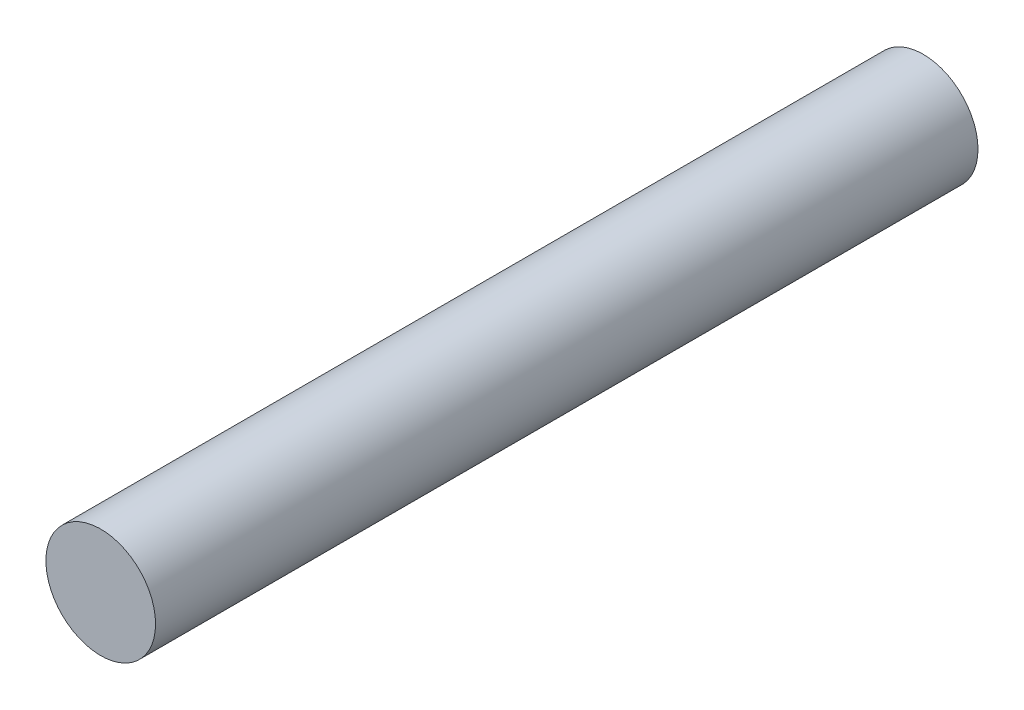
ISO-10303-21;
HEADER;
FILE_DESCRIPTION(('STEP AP214'),'2;1');
FILE_NAME('part.step','',(''),(''),'','','');
FILE_SCHEMA(('AUTOMOTIVE_DESIGN { 1 0 10303 214 1 1 1 1 }'));
ENDSEC;
DATA;
#1=APPLICATION_CONTEXT('core data for automotive mechanical design processes');
#2=APPLICATION_PROTOCOL_DEFINITION('international standard','automotive_design',2000,#1);
#3=PRODUCT_CONTEXT('',#1,'mechanical');
#4=PRODUCT('Part','Part','',(#3));
#5=PRODUCT_RELATED_PRODUCT_CATEGORY('part','',(#4));
#6=PRODUCT_DEFINITION_FORMATION('','',#4);
#7=PRODUCT_DEFINITION_CONTEXT('part definition',#1,'design');
#8=PRODUCT_DEFINITION('design','',#6,#7);
#9=PRODUCT_DEFINITION_SHAPE('','',#8);
#10=(LENGTH_UNIT() NAMED_UNIT(*) SI_UNIT(.MILLI.,.METRE.));
#11=(NAMED_UNIT(*) PLANE_ANGLE_UNIT() SI_UNIT($,.RADIAN.));
#12=(NAMED_UNIT(*) SI_UNIT($,.STERADIAN.) SOLID_ANGLE_UNIT());
#13=UNCERTAINTY_MEASURE_WITH_UNIT(LENGTH_MEASURE(1.E-05),#10,'distance_accuracy_value','');
#14=(GEOMETRIC_REPRESENTATION_CONTEXT(3) GLOBAL_UNCERTAINTY_ASSIGNED_CONTEXT((#13)) GLOBAL_UNIT_ASSIGNED_CONTEXT((#10,
#11,#12)) REPRESENTATION_CONTEXT('',''));
#15=CARTESIAN_POINT('',(0.,0.,0.));
#16=DIRECTION('',(0.,0.,1.));
#17=DIRECTION('',(1.,0.,0.));
#18=AXIS2_PLACEMENT_3D('',#15,#16,#17);
#19=CARTESIAN_POINT('',(0.,0.,75.));
#20=DIRECTION('',(0.,0.,-1.));
#21=DIRECTION('',(-1.,0.,0.));
#22=AXIS2_PLACEMENT_3D('',#19,#20,#21);
#23=CYLINDRICAL_SURFACE('',#22,5.);
#24=CARTESIAN_POINT('',(0.,0.,75.));
#25=DIRECTION('',(0.,0.,1.));
#26=DIRECTION('',(1.,0.,0.));
#27=AXIS2_PLACEMENT_3D('',#24,#25,#26);
#28=CIRCLE('',#27,5.);
#29=CARTESIAN_POINT('',(5.,0.,75.));
#30=VERTEX_POINT('',#29);
#31=EDGE_CURVE('E10',#30,#30,#28,.T.);
#32=ORIENTED_EDGE('',*,*,#31,.F.);
#33=EDGE_LOOP('',(#32));
#34=FACE_BOUND('',#33,.T.);
#35=CARTESIAN_POINT('',(0.,0.,0.));
#36=DIRECTION('',(0.,0.,1.));
#37=DIRECTION('',(1.,0.,0.));
#38=AXIS2_PLACEMENT_3D('',#35,#36,#37);
#39=CIRCLE('',#38,5.);
#40=CARTESIAN_POINT('',(5.,0.,0.));
#41=VERTEX_POINT('',#40);
#42=EDGE_CURVE('E38',#41,#41,#39,.T.);
#43=ORIENTED_EDGE('',*,*,#42,.T.);
#44=EDGE_LOOP('',(#43));
#45=FACE_BOUND('',#44,.T.);
#46=ADVANCED_FACE('F35',(#34,#45),#23,.T.);
#47=CARTESIAN_POINT('',(0.,0.,75.));
#48=DIRECTION('',(0.,0.,1.));
#49=DIRECTION('',(1.,0.,0.));
#50=AXIS2_PLACEMENT_3D('',#47,#48,#49);
#51=PLANE('',#50);
#52=ORIENTED_EDGE('',*,*,#31,.T.);
#53=EDGE_LOOP('',(#52));
#54=FACE_BOUND('',#53,.T.);
#55=ADVANCED_FACE('F50',(#54),#51,.T.);
#56=CARTESIAN_POINT('',(0.,0.,0.));
#57=DIRECTION('',(0.,0.,1.));
#58=DIRECTION('',(1.,0.,0.));
#59=AXIS2_PLACEMENT_3D('',#56,#57,#58);
#60=PLANE('',#59);
#61=ORIENTED_EDGE('',*,*,#42,.F.);
#62=EDGE_LOOP('',(#61));
#63=FACE_BOUND('',#62,.T.);
#64=ADVANCED_FACE('F48',(#63),#60,.F.);
#65=CLOSED_SHELL('',(#46,#55,#64));
#66=MANIFOLD_SOLID_BREP('B2',#65);
#67=ADVANCED_BREP_SHAPE_REPRESENTATION('',(#18,#66),#14);
#68=SHAPE_DEFINITION_REPRESENTATION(#9,#67);
ENDSEC;
END-ISO-10303-21;
